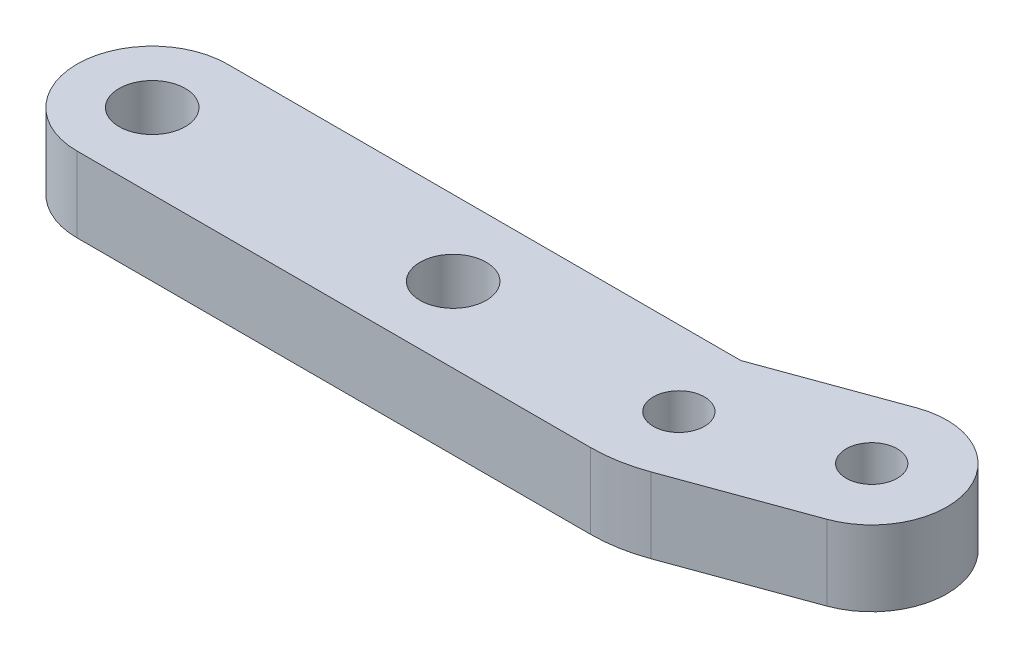
ISO-10303-21;
HEADER;
FILE_DESCRIPTION(('STEP AP214'),'2;1');
FILE_NAME('part.step','',(''),(''),'','','');
FILE_SCHEMA(('AUTOMOTIVE_DESIGN { 1 0 10303 214 1 1 1 1 }'));
ENDSEC;
DATA;
#1=APPLICATION_CONTEXT('core data for automotive mechanical design processes');
#2=APPLICATION_PROTOCOL_DEFINITION('international standard','automotive_design',2000,#1);
#3=PRODUCT_CONTEXT('',#1,'mechanical');
#4=PRODUCT('Part','Part','',(#3));
#5=PRODUCT_RELATED_PRODUCT_CATEGORY('part','',(#4));
#6=PRODUCT_DEFINITION_FORMATION('','',#4);
#7=PRODUCT_DEFINITION_CONTEXT('part definition',#1,'design');
#8=PRODUCT_DEFINITION('design','',#6,#7);
#9=PRODUCT_DEFINITION_SHAPE('','',#8);
#10=(LENGTH_UNIT() NAMED_UNIT(*) SI_UNIT(.MILLI.,.METRE.));
#11=(NAMED_UNIT(*) PLANE_ANGLE_UNIT() SI_UNIT($,.RADIAN.));
#12=(NAMED_UNIT(*) SI_UNIT($,.STERADIAN.) SOLID_ANGLE_UNIT());
#13=UNCERTAINTY_MEASURE_WITH_UNIT(LENGTH_MEASURE(1.E-05),#10,'distance_accuracy_value','');
#14=(GEOMETRIC_REPRESENTATION_CONTEXT(3) GLOBAL_UNCERTAINTY_ASSIGNED_CONTEXT((#13)) GLOBAL_UNIT_ASSIGNED_CONTEXT((#10,
#11,#12)) REPRESENTATION_CONTEXT('',''));
#15=CARTESIAN_POINT('',(0.,0.,0.));
#16=DIRECTION('',(0.,0.,1.));
#17=DIRECTION('',(1.,0.,0.));
#18=AXIS2_PLACEMENT_3D('',#15,#16,#17);
#19=CARTESIAN_POINT('',(0.,5.,0.));
#20=DIRECTION('',(0.,-1.,0.));
#21=DIRECTION('',(0.,0.,-1.));
#22=AXIS2_PLACEMENT_3D('',#19,#20,#21);
#23=PLANE('',#22);
#24=CARTESIAN_POINT('',(0.,5.,0.));
#25=DIRECTION('',(0.,1.,0.));
#26=DIRECTION('',(0.,0.,-1.));
#27=AXIS2_PLACEMENT_3D('',#24,#25,#26);
#28=CIRCLE('',#27,5.);
#29=CARTESIAN_POINT('',(0.,5.,-5.));
#30=VERTEX_POINT('',#29);
#31=CARTESIAN_POINT('',(0.,5.,5.));
#32=VERTEX_POINT('',#31);
#33=EDGE_CURVE('E161',#30,#32,#28,.T.);
#34=ORIENTED_EDGE('',*,*,#33,.T.);
#35=DIRECTION('',(1.,0.,0.));
#36=VECTOR('',#35,1.);
#37=CARTESIAN_POINT('',(0.,5.,5.));
#38=LINE('',#37,#36);
#39=CARTESIAN_POINT('',(34.1183650964577,5.,5.));
#40=VERTEX_POINT('',#39);
#41=EDGE_CURVE('E103',#32,#40,#38,.T.);
#42=ORIENTED_EDGE('',*,*,#41,.T.);
#43=CARTESIAN_POINT('',(34.1183650964577,5.,-5.));
#44=DIRECTION('',(0.,1.,0.));
#45=DIRECTION('',(0.,0.,1.));
#46=AXIS2_PLACEMENT_3D('',#43,#44,#45);
#47=CIRCLE('',#46,10.);
#48=CARTESIAN_POINT('',(37.5385665297144,5.,4.39692620785908));
#49=VERTEX_POINT('',#48);
#50=EDGE_CURVE('E178',#40,#49,#47,.T.);
#51=ORIENTED_EDGE('',*,*,#50,.T.);
#52=DIRECTION('',(0.939692620785908,0.,-0.34202014332567));
#53=VECTOR('',#52,1.);
#54=CARTESIAN_POINT('',(37.5385665297144,5.,4.39692620785907));
#55=LINE('',#54,#53);
#56=CARTESIAN_POINT('',(46.1070269244874,5.,1.27826167067283));
#57=VERTEX_POINT('',#56);
#58=EDGE_CURVE('E119',#49,#57,#55,.T.);
#59=ORIENTED_EDGE('',*,*,#58,.T.);
#60=CARTESIAN_POINT('',(44.3969262078591,5.,-3.4202014332567));
#61=DIRECTION('',(0.,1.,0.));
#62=DIRECTION('',(0.,0.,-1.));
#63=AXIS2_PLACEMENT_3D('',#60,#61,#62);
#64=CIRCLE('',#63,5.);
#65=CARTESIAN_POINT('',(42.6868254912307,5.,-8.11866453718624));
#66=VERTEX_POINT('',#65);
#67=EDGE_CURVE('E113',#57,#66,#64,.T.);
#68=ORIENTED_EDGE('',*,*,#67,.T.);
#69=DIRECTION('',(-0.939692620785908,0.,0.34202014332567));
#70=VECTOR('',#69,1.);
#71=CARTESIAN_POINT('',(34.1183650964577,5.,-5.));
#72=LINE('',#71,#70);
#73=CARTESIAN_POINT('',(34.1183650964577,5.,-5.));
#74=VERTEX_POINT('',#73);
#75=EDGE_CURVE('E117',#66,#74,#72,.T.);
#76=ORIENTED_EDGE('',*,*,#75,.T.);
#77=DIRECTION('',(-1.,0.,0.));
#78=VECTOR('',#77,1.);
#79=CARTESIAN_POINT('',(0.,5.,-5.));
#80=LINE('',#79,#78);
#81=EDGE_CURVE('E63',#74,#30,#80,.T.);
#82=ORIENTED_EDGE('',*,*,#81,.T.);
#83=EDGE_LOOP('',(#34,#42,#51,#59,#68,#76,#82));
#84=FACE_BOUND('',#83,.T.);
#85=CARTESIAN_POINT('',(0.,5.,0.));
#86=DIRECTION('',(0.,1.,0.));
#87=DIRECTION('',(0.,0.,1.));
#88=AXIS2_PLACEMENT_3D('',#85,#86,#87);
#89=CIRCLE('',#88,2.2);
#90=CARTESIAN_POINT('',(0.,5.,2.2));
#91=VERTEX_POINT('',#90);
#92=EDGE_CURVE('E146',#91,#91,#89,.T.);
#93=ORIENTED_EDGE('',*,*,#92,.F.);
#94=EDGE_LOOP('',(#93));
#95=FACE_BOUND('',#94,.T.);
#96=CARTESIAN_POINT('',(20.,5.,0.));
#97=DIRECTION('',(0.,1.,0.));
#98=DIRECTION('',(0.,0.,1.));
#99=AXIS2_PLACEMENT_3D('',#96,#97,#98);
#100=CIRCLE('',#99,2.2);
#101=CARTESIAN_POINT('',(20.,5.,2.2));
#102=VERTEX_POINT('',#101);
#103=EDGE_CURVE('E198',#102,#102,#100,.T.);
#104=ORIENTED_EDGE('',*,*,#103,.F.);
#105=EDGE_LOOP('',(#104));
#106=FACE_BOUND('',#105,.T.);
#107=CARTESIAN_POINT('',(44.3969262078591,5.,-3.4202014332567));
#108=DIRECTION('',(0.,1.,0.));
#109=DIRECTION('',(0.,0.,1.));
#110=AXIS2_PLACEMENT_3D('',#107,#108,#109);
#111=CIRCLE('',#110,1.7);
#112=CARTESIAN_POINT('',(44.3969262078591,5.,-1.7202014332567));
#113=VERTEX_POINT('',#112);
#114=EDGE_CURVE('E206',#113,#113,#111,.T.);
#115=ORIENTED_EDGE('',*,*,#114,.F.);
#116=EDGE_LOOP('',(#115));
#117=FACE_BOUND('',#116,.T.);
#118=CARTESIAN_POINT('',(35.,5.,0.));
#119=DIRECTION('',(0.,1.,0.));
#120=DIRECTION('',(0.,0.,1.));
#121=AXIS2_PLACEMENT_3D('',#118,#119,#120);
#122=CIRCLE('',#121,1.7);
#123=CARTESIAN_POINT('',(35.,5.,1.7));
#124=VERTEX_POINT('',#123);
#125=EDGE_CURVE('E214',#124,#124,#122,.T.);
#126=ORIENTED_EDGE('',*,*,#125,.F.);
#127=EDGE_LOOP('',(#126));
#128=FACE_BOUND('',#127,.T.);
#129=ADVANCED_FACE('F45',(#84,#95,#106,#117,#128),#23,.F.);
#130=CARTESIAN_POINT('',(0.,0.,0.));
#131=DIRECTION('',(0.,-1.,0.));
#132=DIRECTION('',(0.,0.,-1.));
#133=AXIS2_PLACEMENT_3D('',#130,#131,#132);
#134=PLANE('',#133);
#135=CARTESIAN_POINT('',(44.3969262078591,0.,-3.4202014332567));
#136=DIRECTION('',(0.,1.,0.));
#137=DIRECTION('',(0.,0.,1.));
#138=AXIS2_PLACEMENT_3D('',#135,#136,#137);
#139=CIRCLE('',#138,1.7);
#140=CARTESIAN_POINT('',(44.3969262078591,0.,-1.7202014332567));
#141=VERTEX_POINT('',#140);
#142=EDGE_CURVE('E210',#141,#141,#139,.T.);
#143=ORIENTED_EDGE('',*,*,#142,.T.);
#144=EDGE_LOOP('',(#143));
#145=FACE_BOUND('',#144,.T.);
#146=CARTESIAN_POINT('',(0.,0.,0.));
#147=DIRECTION('',(0.,1.,0.));
#148=DIRECTION('',(0.,0.,1.));
#149=AXIS2_PLACEMENT_3D('',#146,#147,#148);
#150=CIRCLE('',#149,2.2);
#151=CARTESIAN_POINT('',(0.,0.,2.2));
#152=VERTEX_POINT('',#151);
#153=EDGE_CURVE('E194',#152,#152,#150,.T.);
#154=ORIENTED_EDGE('',*,*,#153,.T.);
#155=EDGE_LOOP('',(#154));
#156=FACE_BOUND('',#155,.T.);
#157=CARTESIAN_POINT('',(0.,0.,0.));
#158=DIRECTION('',(0.,1.,0.));
#159=DIRECTION('',(0.,0.,-1.));
#160=AXIS2_PLACEMENT_3D('',#157,#158,#159);
#161=CIRCLE('',#160,5.);
#162=CARTESIAN_POINT('',(0.,0.,-5.));
#163=VERTEX_POINT('',#162);
#164=CARTESIAN_POINT('',(0.,0.,5.));
#165=VERTEX_POINT('',#164);
#166=EDGE_CURVE('E141',#163,#165,#161,.T.);
#167=ORIENTED_EDGE('',*,*,#166,.F.);
#168=DIRECTION('',(-1.,0.,0.));
#169=VECTOR('',#168,1.);
#170=CARTESIAN_POINT('',(0.,0.,-5.));
#171=LINE('',#170,#169);
#172=CARTESIAN_POINT('',(34.1183650964577,0.,-5.));
#173=VERTEX_POINT('',#172);
#174=EDGE_CURVE('E95',#173,#163,#171,.T.);
#175=ORIENTED_EDGE('',*,*,#174,.F.);
#176=DIRECTION('',(-0.939692620785908,0.,0.34202014332567));
#177=VECTOR('',#176,1.);
#178=CARTESIAN_POINT('',(34.1183650964577,0.,-5.));
#179=LINE('',#178,#177);
#180=CARTESIAN_POINT('',(42.6868254912307,0.,-8.11866453718624));
#181=VERTEX_POINT('',#180);
#182=EDGE_CURVE('E89',#181,#173,#179,.T.);
#183=ORIENTED_EDGE('',*,*,#182,.F.);
#184=CARTESIAN_POINT('',(44.3969262078591,0.,-3.4202014332567));
#185=DIRECTION('',(0.,1.,0.));
#186=DIRECTION('',(0.,0.,-1.));
#187=AXIS2_PLACEMENT_3D('',#184,#185,#186);
#188=CIRCLE('',#187,5.);
#189=CARTESIAN_POINT('',(46.1070269244874,0.,1.27826167067283));
#190=VERTEX_POINT('',#189);
#191=EDGE_CURVE('E128',#190,#181,#188,.T.);
#192=ORIENTED_EDGE('',*,*,#191,.F.);
#193=DIRECTION('',(0.939692620785908,0.,-0.34202014332567));
#194=VECTOR('',#193,1.);
#195=CARTESIAN_POINT('',(37.5385665297144,0.,4.39692620785907));
#196=LINE('',#195,#194);
#197=CARTESIAN_POINT('',(37.5385665297144,0.,4.39692620785908));
#198=VERTEX_POINT('',#197);
#199=EDGE_CURVE('E152',#198,#190,#196,.T.);
#200=ORIENTED_EDGE('',*,*,#199,.F.);
#201=CARTESIAN_POINT('',(34.1183650964577,0.,-5.));
#202=DIRECTION('',(0.,1.,0.));
#203=DIRECTION('',(0.,0.,1.));
#204=AXIS2_PLACEMENT_3D('',#201,#202,#203);
#205=CIRCLE('',#204,10.);
#206=CARTESIAN_POINT('',(34.1183650964577,0.,5.));
#207=VERTEX_POINT('',#206);
#208=EDGE_CURVE('E149',#207,#198,#205,.T.);
#209=ORIENTED_EDGE('',*,*,#208,.F.);
#210=DIRECTION('',(1.,0.,0.));
#211=VECTOR('',#210,1.);
#212=CARTESIAN_POINT('',(0.,0.,5.));
#213=LINE('',#212,#211);
#214=EDGE_CURVE('E145',#165,#207,#213,.T.);
#215=ORIENTED_EDGE('',*,*,#214,.F.);
#216=EDGE_LOOP('',(#167,#175,#183,#192,#200,#209,#215));
#217=FACE_BOUND('',#216,.T.);
#218=CARTESIAN_POINT('',(20.,0.,0.));
#219=DIRECTION('',(0.,1.,0.));
#220=DIRECTION('',(0.,0.,1.));
#221=AXIS2_PLACEMENT_3D('',#218,#219,#220);
#222=CIRCLE('',#221,2.2);
#223=CARTESIAN_POINT('',(20.,0.,2.2));
#224=VERTEX_POINT('',#223);
#225=EDGE_CURVE('E202',#224,#224,#222,.T.);
#226=ORIENTED_EDGE('',*,*,#225,.T.);
#227=EDGE_LOOP('',(#226));
#228=FACE_BOUND('',#227,.T.);
#229=CARTESIAN_POINT('',(35.,0.,0.));
#230=DIRECTION('',(0.,1.,0.));
#231=DIRECTION('',(0.,0.,1.));
#232=AXIS2_PLACEMENT_3D('',#229,#230,#231);
#233=CIRCLE('',#232,1.7);
#234=CARTESIAN_POINT('',(35.,0.,1.7));
#235=VERTEX_POINT('',#234);
#236=EDGE_CURVE('E218',#235,#235,#233,.T.);
#237=ORIENTED_EDGE('',*,*,#236,.T.);
#238=EDGE_LOOP('',(#237));
#239=FACE_BOUND('',#238,.T.);
#240=ADVANCED_FACE('F182',(#145,#156,#217,#228,#239),#134,.T.);
#241=CARTESIAN_POINT('',(0.,5.,0.));
#242=DIRECTION('',(0.,-1.,0.));
#243=DIRECTION('',(0.,0.,-1.));
#244=AXIS2_PLACEMENT_3D('',#241,#242,#243);
#245=CYLINDRICAL_SURFACE('',#244,5.);
#246=ORIENTED_EDGE('',*,*,#166,.T.);
#247=DIRECTION('',(0.,-1.,0.));
#248=VECTOR('',#247,1.);
#249=CARTESIAN_POINT('',(0.,5.,5.));
#250=LINE('',#249,#248);
#251=EDGE_CURVE('E11',#32,#165,#250,.T.);
#252=ORIENTED_EDGE('',*,*,#251,.F.);
#253=ORIENTED_EDGE('',*,*,#33,.F.);
#254=DIRECTION('',(0.,-1.,0.));
#255=VECTOR('',#254,1.);
#256=CARTESIAN_POINT('',(0.,5.,-5.));
#257=LINE('',#256,#255);
#258=EDGE_CURVE('E137',#30,#163,#257,.T.);
#259=ORIENTED_EDGE('',*,*,#258,.T.);
#260=EDGE_LOOP('',(#246,#252,#253,#259));
#261=FACE_BOUND('',#260,.T.);
#262=ADVANCED_FACE('F47',(#261),#245,.T.);
#263=CARTESIAN_POINT('',(0.,5.,5.));
#264=DIRECTION('',(0.,0.,-1.));
#265=DIRECTION('',(-1.,0.,0.));
#266=AXIS2_PLACEMENT_3D('',#263,#264,#265);
#267=PLANE('',#266);
#268=ORIENTED_EDGE('',*,*,#214,.T.);
#269=DIRECTION('',(0.,-1.,0.));
#270=VECTOR('',#269,1.);
#271=CARTESIAN_POINT('',(34.1183650964577,5.,5.));
#272=LINE('',#271,#270);
#273=EDGE_CURVE('E55',#40,#207,#272,.T.);
#274=ORIENTED_EDGE('',*,*,#273,.F.);
#275=ORIENTED_EDGE('',*,*,#41,.F.);
#276=ORIENTED_EDGE('',*,*,#251,.T.);
#277=EDGE_LOOP('',(#268,#274,#275,#276));
#278=FACE_BOUND('',#277,.T.);
#279=ADVANCED_FACE('F250',(#278),#267,.F.);
#280=CARTESIAN_POINT('',(34.1183650964577,5.,-5.));
#281=DIRECTION('',(0.,-1.,0.));
#282=DIRECTION('',(0.,0.,-1.));
#283=AXIS2_PLACEMENT_3D('',#280,#281,#282);
#284=CYLINDRICAL_SURFACE('',#283,10.);
#285=ORIENTED_EDGE('',*,*,#208,.T.);
#286=DIRECTION('',(0.,-1.,0.));
#287=VECTOR('',#286,1.);
#288=CARTESIAN_POINT('',(37.5385665297144,5.,4.39692620785908));
#289=LINE('',#288,#287);
#290=EDGE_CURVE('E168',#49,#198,#289,.T.);
#291=ORIENTED_EDGE('',*,*,#290,.F.);
#292=ORIENTED_EDGE('',*,*,#50,.F.);
#293=ORIENTED_EDGE('',*,*,#273,.T.);
#294=EDGE_LOOP('',(#285,#291,#292,#293));
#295=FACE_BOUND('',#294,.T.);
#296=ADVANCED_FACE('F176',(#295),#284,.T.);
#297=CARTESIAN_POINT('',(37.5385665297144,5.,4.39692620785907));
#298=DIRECTION('',(-0.34202014332567,0.,-0.939692620785908));
#299=DIRECTION('',(-0.939692620785908,0.,0.34202014332567));
#300=AXIS2_PLACEMENT_3D('',#297,#298,#299);
#301=PLANE('',#300);
#302=ORIENTED_EDGE('',*,*,#199,.T.);
#303=DIRECTION('',(0.,-1.,0.));
#304=VECTOR('',#303,1.);
#305=CARTESIAN_POINT('',(46.1070269244874,5.,1.27826167067283));
#306=LINE('',#305,#304);
#307=EDGE_CURVE('E130',#57,#190,#306,.T.);
#308=ORIENTED_EDGE('',*,*,#307,.F.);
#309=ORIENTED_EDGE('',*,*,#58,.F.);
#310=ORIENTED_EDGE('',*,*,#290,.T.);
#311=EDGE_LOOP('',(#302,#308,#309,#310));
#312=FACE_BOUND('',#311,.T.);
#313=ADVANCED_FACE('F185',(#312),#301,.F.);
#314=CARTESIAN_POINT('',(44.3969262078591,5.,-3.4202014332567));
#315=DIRECTION('',(0.,-1.,0.));
#316=DIRECTION('',(0.,0.,-1.));
#317=AXIS2_PLACEMENT_3D('',#314,#315,#316);
#318=CYLINDRICAL_SURFACE('',#317,5.);
#319=ORIENTED_EDGE('',*,*,#191,.T.);
#320=DIRECTION('',(0.,-1.,0.));
#321=VECTOR('',#320,1.);
#322=CARTESIAN_POINT('',(42.6868254912307,5.,-8.11866453718624));
#323=LINE('',#322,#321);
#324=EDGE_CURVE('E125',#66,#181,#323,.T.);
#325=ORIENTED_EDGE('',*,*,#324,.F.);
#326=ORIENTED_EDGE('',*,*,#67,.F.);
#327=ORIENTED_EDGE('',*,*,#307,.T.);
#328=EDGE_LOOP('',(#319,#325,#326,#327));
#329=FACE_BOUND('',#328,.T.);
#330=ADVANCED_FACE('F126',(#329),#318,.T.);
#331=CARTESIAN_POINT('',(34.1183650964577,5.,-5.));
#332=DIRECTION('',(0.34202014332567,0.,0.939692620785908));
#333=DIRECTION('',(0.939692620785908,0.,-0.34202014332567));
#334=AXIS2_PLACEMENT_3D('',#331,#332,#333);
#335=PLANE('',#334);
#336=ORIENTED_EDGE('',*,*,#182,.T.);
#337=DIRECTION('',(0.,-1.,0.));
#338=VECTOR('',#337,1.);
#339=CARTESIAN_POINT('',(34.1183650964577,5.,-5.));
#340=LINE('',#339,#338);
#341=EDGE_CURVE('E131',#74,#173,#340,.T.);
#342=ORIENTED_EDGE('',*,*,#341,.F.);
#343=ORIENTED_EDGE('',*,*,#75,.F.);
#344=ORIENTED_EDGE('',*,*,#324,.T.);
#345=EDGE_LOOP('',(#336,#342,#343,#344));
#346=FACE_BOUND('',#345,.T.);
#347=ADVANCED_FACE('F133',(#346),#335,.F.);
#348=CARTESIAN_POINT('',(0.,5.,-5.));
#349=DIRECTION('',(0.,0.,1.));
#350=DIRECTION('',(1.,0.,0.));
#351=AXIS2_PLACEMENT_3D('',#348,#349,#350);
#352=PLANE('',#351);
#353=ORIENTED_EDGE('',*,*,#174,.T.);
#354=ORIENTED_EDGE('',*,*,#258,.F.);
#355=ORIENTED_EDGE('',*,*,#81,.F.);
#356=ORIENTED_EDGE('',*,*,#341,.T.);
#357=EDGE_LOOP('',(#353,#354,#355,#356));
#358=FACE_BOUND('',#357,.T.);
#359=ADVANCED_FACE('F240',(#358),#352,.F.);
#360=CARTESIAN_POINT('',(0.,5.,0.));
#361=DIRECTION('',(0.,-1.,0.));
#362=DIRECTION('',(0.,0.,-1.));
#363=AXIS2_PLACEMENT_3D('',#360,#361,#362);
#364=CYLINDRICAL_SURFACE('',#363,2.2);
#365=ORIENTED_EDGE('',*,*,#92,.T.);
#366=EDGE_LOOP('',(#365));
#367=FACE_BOUND('',#366,.T.);
#368=ORIENTED_EDGE('',*,*,#153,.F.);
#369=EDGE_LOOP('',(#368));
#370=FACE_BOUND('',#369,.T.);
#371=ADVANCED_FACE('F237',(#367,#370),#364,.F.);
#372=CARTESIAN_POINT('',(20.,5.,0.));
#373=DIRECTION('',(0.,-1.,0.));
#374=DIRECTION('',(0.,0.,-1.));
#375=AXIS2_PLACEMENT_3D('',#372,#373,#374);
#376=CYLINDRICAL_SURFACE('',#375,2.2);
#377=ORIENTED_EDGE('',*,*,#103,.T.);
#378=EDGE_LOOP('',(#377));
#379=FACE_BOUND('',#378,.T.);
#380=ORIENTED_EDGE('',*,*,#225,.F.);
#381=EDGE_LOOP('',(#380));
#382=FACE_BOUND('',#381,.T.);
#383=ADVANCED_FACE('F308',(#379,#382),#376,.F.);
#384=CARTESIAN_POINT('',(44.3969262078591,5.,-3.4202014332567));
#385=DIRECTION('',(0.,-1.,0.));
#386=DIRECTION('',(0.,0.,-1.));
#387=AXIS2_PLACEMENT_3D('',#384,#385,#386);
#388=CYLINDRICAL_SURFACE('',#387,1.7);
#389=ORIENTED_EDGE('',*,*,#114,.T.);
#390=EDGE_LOOP('',(#389));
#391=FACE_BOUND('',#390,.T.);
#392=ORIENTED_EDGE('',*,*,#142,.F.);
#393=EDGE_LOOP('',(#392));
#394=FACE_BOUND('',#393,.T.);
#395=ADVANCED_FACE('F316',(#391,#394),#388,.F.);
#396=CARTESIAN_POINT('',(35.,5.,0.));
#397=DIRECTION('',(0.,-1.,0.));
#398=DIRECTION('',(0.,0.,-1.));
#399=AXIS2_PLACEMENT_3D('',#396,#397,#398);
#400=CYLINDRICAL_SURFACE('',#399,1.7);
#401=ORIENTED_EDGE('',*,*,#125,.T.);
#402=EDGE_LOOP('',(#401));
#403=FACE_BOUND('',#402,.T.);
#404=ORIENTED_EDGE('',*,*,#236,.F.);
#405=EDGE_LOOP('',(#404));
#406=FACE_BOUND('',#405,.T.);
#407=ADVANCED_FACE('F226',(#403,#406),#400,.F.);
#408=CLOSED_SHELL('',(#129,#240,#262,#279,#296,#313,#330,#347,#359,#371,#383,#395,#407));
#409=MANIFOLD_SOLID_BREP('B2',#408);
#410=ADVANCED_BREP_SHAPE_REPRESENTATION('',(#18,#409),#14);
#411=SHAPE_DEFINITION_REPRESENTATION(#9,#410);
ENDSEC;
END-ISO-10303-21;
